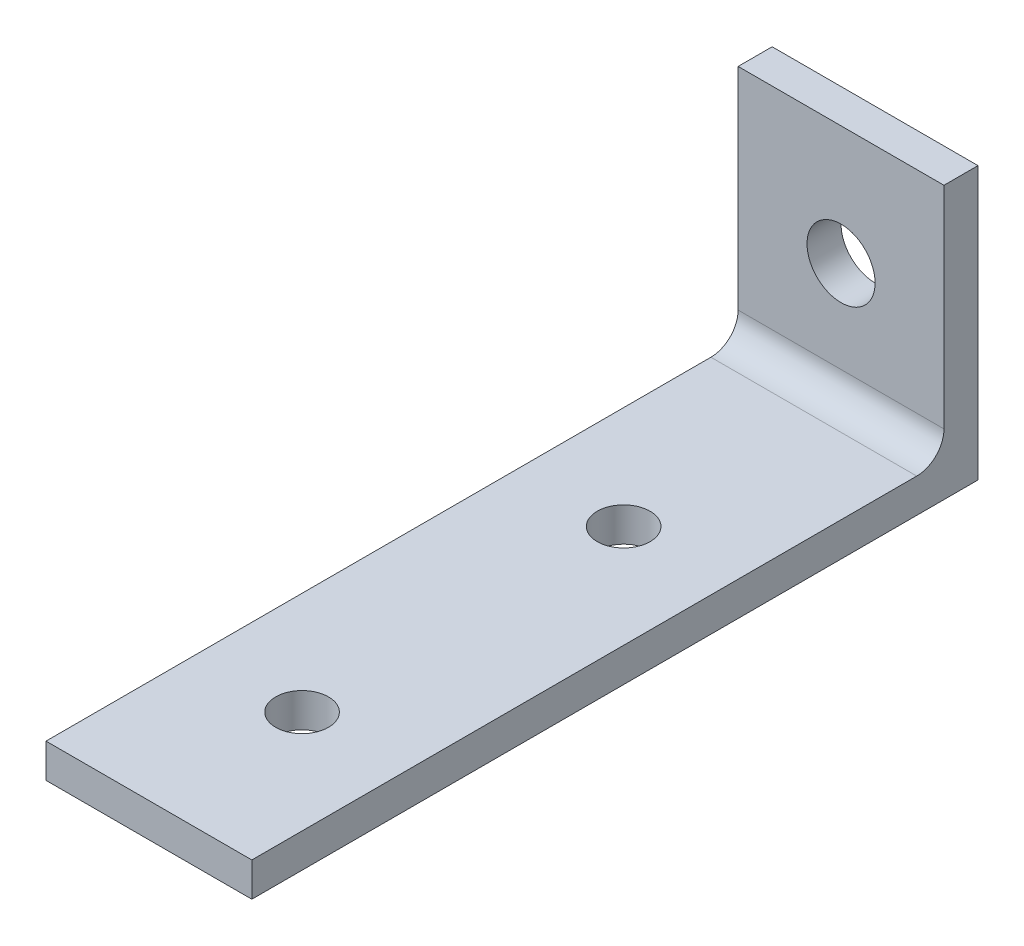
ISO-10303-21;
HEADER;
FILE_DESCRIPTION(('STEP AP214'),'2;1');
FILE_NAME('part.step','',(''),(''),'','','');
FILE_SCHEMA(('AUTOMOTIVE_DESIGN { 1 0 10303 214 1 1 1 1 }'));
ENDSEC;
DATA;
#1=APPLICATION_CONTEXT('core data for automotive mechanical design processes');
#2=APPLICATION_PROTOCOL_DEFINITION('international standard','automotive_design',2000,#1);
#3=PRODUCT_CONTEXT('',#1,'mechanical');
#4=PRODUCT('Part','Part','',(#3));
#5=PRODUCT_RELATED_PRODUCT_CATEGORY('part','',(#4));
#6=PRODUCT_DEFINITION_FORMATION('','',#4);
#7=PRODUCT_DEFINITION_CONTEXT('part definition',#1,'design');
#8=PRODUCT_DEFINITION('design','',#6,#7);
#9=PRODUCT_DEFINITION_SHAPE('','',#8);
#10=(LENGTH_UNIT() NAMED_UNIT(*) SI_UNIT(.MILLI.,.METRE.));
#11=(NAMED_UNIT(*) PLANE_ANGLE_UNIT() SI_UNIT($,.RADIAN.));
#12=(NAMED_UNIT(*) SI_UNIT($,.STERADIAN.) SOLID_ANGLE_UNIT());
#13=UNCERTAINTY_MEASURE_WITH_UNIT(LENGTH_MEASURE(1.E-05),#10,'distance_accuracy_value','');
#14=(GEOMETRIC_REPRESENTATION_CONTEXT(3) GLOBAL_UNCERTAINTY_ASSIGNED_CONTEXT((#13)) GLOBAL_UNIT_ASSIGNED_CONTEXT((#10,
#11,#12)) REPRESENTATION_CONTEXT('',''));
#15=CARTESIAN_POINT('',(0.,0.,0.));
#16=DIRECTION('',(0.,0.,1.));
#17=DIRECTION('',(1.,0.,0.));
#18=AXIS2_PLACEMENT_3D('',#15,#16,#17);
#19=CARTESIAN_POINT('',(19.2024,12.7,-22.225));
#20=DIRECTION('',(0.,0.,-1.));
#21=DIRECTION('',(0.,1.,0.));
#22=AXIS2_PLACEMENT_3D('',#19,#20,#21);
#23=PLANE('',#22);
#24=CARTESIAN_POINT('',(9.6012,1.5875,-22.225));
#25=DIRECTION('',(0.,0.,1.));
#26=DIRECTION('',(1.,0.,0.));
#27=AXIS2_PLACEMENT_3D('',#24,#25,#26);
#28=CIRCLE('',#27,3.175);
#29=CARTESIAN_POINT('',(12.7762,1.5875,-22.225));
#30=VERTEX_POINT('',#29);
#31=EDGE_CURVE('E138',#30,#30,#28,.T.);
#32=ORIENTED_EDGE('',*,*,#31,.F.);
#33=EDGE_LOOP('',(#32));
#34=FACE_BOUND('',#33,.T.);
#35=DIRECTION('',(0.,-1.,0.));
#36=VECTOR('',#35,1.);
#37=CARTESIAN_POINT('',(0.,12.7,-22.225));
#38=LINE('',#37,#36);
#39=CARTESIAN_POINT('',(0.,12.7,-22.225));
#40=VERTEX_POINT('',#39);
#41=CARTESIAN_POINT('',(0.,-6.985,-22.225));
#42=VERTEX_POINT('',#41);
#43=EDGE_CURVE('E110',#40,#42,#38,.T.);
#44=ORIENTED_EDGE('',*,*,#43,.T.);
#45=DIRECTION('',(-1.,0.,0.));
#46=VECTOR('',#45,1.);
#47=CARTESIAN_POINT('',(19.2024,-6.985,-22.225));
#48=LINE('',#47,#46);
#49=CARTESIAN_POINT('',(19.2024,-6.985,-22.225));
#50=VERTEX_POINT('',#49);
#51=EDGE_CURVE('E32',#42,#50,#48,.F.);
#52=ORIENTED_EDGE('',*,*,#51,.T.);
#53=DIRECTION('',(0.,-1.,0.));
#54=VECTOR('',#53,1.);
#55=CARTESIAN_POINT('',(19.2024,12.7,-22.225));
#56=LINE('',#55,#54);
#57=CARTESIAN_POINT('',(19.2024,12.7,-22.225));
#58=VERTEX_POINT('',#57);
#59=EDGE_CURVE('E85',#58,#50,#56,.T.);
#60=ORIENTED_EDGE('',*,*,#59,.F.);
#61=DIRECTION('',(-1.,0.,0.));
#62=VECTOR('',#61,1.);
#63=CARTESIAN_POINT('',(19.2024,12.7,-22.225));
#64=LINE('',#63,#62);
#65=EDGE_CURVE('E109',#58,#40,#64,.T.);
#66=ORIENTED_EDGE('',*,*,#65,.T.);
#67=EDGE_LOOP('',(#44,#52,#60,#66));
#68=FACE_BOUND('',#67,.T.);
#69=ADVANCED_FACE('F17',(#34,#68),#23,.F.);
#70=CARTESIAN_POINT('',(19.2024,-9.525,25.4));
#71=DIRECTION('',(0.,-1.,0.));
#72=DIRECTION('',(0.,0.,-1.));
#73=AXIS2_PLACEMENT_3D('',#70,#71,#72);
#74=PLANE('',#73);
#75=CARTESIAN_POINT('',(9.6012,-9.525,-1.9457));
#76=DIRECTION('',(0.,1.,0.));
#77=DIRECTION('',(0.,0.,1.));
#78=AXIS2_PLACEMENT_3D('',#75,#76,#77);
#79=CIRCLE('',#78,2.4638);
#80=CARTESIAN_POINT('',(9.6012,-9.525,0.5181));
#81=VERTEX_POINT('',#80);
#82=EDGE_CURVE('E135',#81,#81,#79,.T.);
#83=ORIENTED_EDGE('',*,*,#82,.F.);
#84=EDGE_LOOP('',(#83));
#85=FACE_BOUND('',#84,.T.);
#86=CARTESIAN_POINT('',(9.6012,-9.525,28.0543));
#87=DIRECTION('',(0.,1.,0.));
#88=DIRECTION('',(0.,0.,1.));
#89=AXIS2_PLACEMENT_3D('',#86,#87,#88);
#90=CIRCLE('',#89,2.4638);
#91=CARTESIAN_POINT('',(9.6012,-9.525,30.5181));
#92=VERTEX_POINT('',#91);
#93=EDGE_CURVE('E160',#92,#92,#90,.T.);
#94=ORIENTED_EDGE('',*,*,#93,.F.);
#95=EDGE_LOOP('',(#94));
#96=FACE_BOUND('',#95,.T.);
#97=DIRECTION('',(0.,0.,1.));
#98=VECTOR('',#97,1.);
#99=CARTESIAN_POINT('',(19.2024,-9.525,-22.225));
#100=LINE('',#99,#98);
#101=CARTESIAN_POINT('',(19.2024,-9.525,-19.685));
#102=VERTEX_POINT('',#101);
#103=CARTESIAN_POINT('',(19.2024,-9.525,42.3418));
#104=VERTEX_POINT('',#103);
#105=EDGE_CURVE('E75',#102,#104,#100,.T.);
#106=ORIENTED_EDGE('',*,*,#105,.F.);
#107=DIRECTION('',(-1.,0.,0.));
#108=VECTOR('',#107,1.);
#109=CARTESIAN_POINT('',(0.,-9.525,-19.685));
#110=LINE('',#109,#108);
#111=CARTESIAN_POINT('',(0.,-9.525,-19.685));
#112=VERTEX_POINT('',#111);
#113=EDGE_CURVE('E94',#102,#112,#110,.T.);
#114=ORIENTED_EDGE('',*,*,#113,.T.);
#115=DIRECTION('',(0.,0.,1.));
#116=VECTOR('',#115,1.);
#117=CARTESIAN_POINT('',(0.,-9.525,25.4));
#118=LINE('',#117,#116);
#119=CARTESIAN_POINT('',(0.,-9.525,42.3418));
#120=VERTEX_POINT('',#119);
#121=EDGE_CURVE('E90',#112,#120,#118,.T.);
#122=ORIENTED_EDGE('',*,*,#121,.T.);
#123=DIRECTION('',(-1.,0.,0.));
#124=VECTOR('',#123,1.);
#125=CARTESIAN_POINT('',(19.2024,-9.525,42.3418));
#126=LINE('',#125,#124);
#127=EDGE_CURVE('E88',#104,#120,#126,.T.);
#128=ORIENTED_EDGE('',*,*,#127,.F.);
#129=EDGE_LOOP('',(#106,#114,#122,#128));
#130=FACE_BOUND('',#129,.T.);
#131=ADVANCED_FACE('F89',(#85,#96,#130),#74,.F.);
#132=CARTESIAN_POINT('',(19.2024,-9.525,42.3418));
#133=DIRECTION('',(0.,0.,-1.));
#134=DIRECTION('',(-1.,0.,0.));
#135=AXIS2_PLACEMENT_3D('',#132,#133,#134);
#136=PLANE('',#135);
#137=DIRECTION('',(0.,-1.,0.));
#138=VECTOR('',#137,1.);
#139=CARTESIAN_POINT('',(0.,-9.525,42.3418));
#140=LINE('',#139,#138);
#141=CARTESIAN_POINT('',(0.,-12.7,42.3418));
#142=VERTEX_POINT('',#141);
#143=EDGE_CURVE('E114',#120,#142,#140,.T.);
#144=ORIENTED_EDGE('',*,*,#143,.T.);
#145=DIRECTION('',(-1.,0.,0.));
#146=VECTOR('',#145,1.);
#147=CARTESIAN_POINT('',(19.2024,-12.7,42.3418));
#148=LINE('',#147,#146);
#149=CARTESIAN_POINT('',(19.2024,-12.7,42.3418));
#150=VERTEX_POINT('',#149);
#151=EDGE_CURVE('E95',#150,#142,#148,.T.);
#152=ORIENTED_EDGE('',*,*,#151,.F.);
#153=DIRECTION('',(0.,-1.,0.));
#154=VECTOR('',#153,1.);
#155=CARTESIAN_POINT('',(19.2024,-9.525,42.3418));
#156=LINE('',#155,#154);
#157=EDGE_CURVE('E79',#104,#150,#156,.T.);
#158=ORIENTED_EDGE('',*,*,#157,.F.);
#159=ORIENTED_EDGE('',*,*,#127,.T.);
#160=EDGE_LOOP('',(#144,#152,#158,#159));
#161=FACE_BOUND('',#160,.T.);
#162=ADVANCED_FACE('F97',(#161),#136,.F.);
#163=CARTESIAN_POINT('',(19.2024,-12.7,-25.4));
#164=DIRECTION('',(0.,1.,0.));
#165=DIRECTION('',(0.,0.,1.));
#166=AXIS2_PLACEMENT_3D('',#163,#164,#165);
#167=PLANE('',#166);
#168=CARTESIAN_POINT('',(9.6012,-12.7,-1.9457));
#169=DIRECTION('',(0.,1.,0.));
#170=DIRECTION('',(0.,0.,1.));
#171=AXIS2_PLACEMENT_3D('',#168,#169,#170);
#172=CIRCLE('',#171,2.4638);
#173=CARTESIAN_POINT('',(9.6012,-12.7,0.5181));
#174=VERTEX_POINT('',#173);
#175=EDGE_CURVE('E134',#174,#174,#172,.T.);
#176=ORIENTED_EDGE('',*,*,#175,.T.);
#177=EDGE_LOOP('',(#176));
#178=FACE_BOUND('',#177,.T.);
#179=CARTESIAN_POINT('',(9.6012,-12.7,28.0543));
#180=DIRECTION('',(0.,1.,0.));
#181=DIRECTION('',(0.,0.,1.));
#182=AXIS2_PLACEMENT_3D('',#179,#180,#181);
#183=CIRCLE('',#182,2.4638);
#184=CARTESIAN_POINT('',(9.6012,-12.7,30.5181));
#185=VERTEX_POINT('',#184);
#186=EDGE_CURVE('E131',#185,#185,#183,.T.);
#187=ORIENTED_EDGE('',*,*,#186,.T.);
#188=EDGE_LOOP('',(#187));
#189=FACE_BOUND('',#188,.T.);
#190=DIRECTION('',(0.,0.,-1.));
#191=VECTOR('',#190,1.);
#192=CARTESIAN_POINT('',(0.,-12.7,-25.4));
#193=LINE('',#192,#191);
#194=CARTESIAN_POINT('',(0.,-12.7,-25.4));
#195=VERTEX_POINT('',#194);
#196=EDGE_CURVE('E116',#142,#195,#193,.T.);
#197=ORIENTED_EDGE('',*,*,#196,.T.);
#198=DIRECTION('',(-1.,0.,0.));
#199=VECTOR('',#198,1.);
#200=CARTESIAN_POINT('',(19.2024,-12.7,-25.4));
#201=LINE('',#200,#199);
#202=CARTESIAN_POINT('',(19.2024,-12.7,-25.4));
#203=VERTEX_POINT('',#202);
#204=EDGE_CURVE('E127',#203,#195,#201,.T.);
#205=ORIENTED_EDGE('',*,*,#204,.F.);
#206=DIRECTION('',(0.,0.,-1.));
#207=VECTOR('',#206,1.);
#208=CARTESIAN_POINT('',(19.2024,-12.7,25.4));
#209=LINE('',#208,#207);
#210=EDGE_CURVE('E100',#150,#203,#209,.T.);
#211=ORIENTED_EDGE('',*,*,#210,.F.);
#212=ORIENTED_EDGE('',*,*,#151,.T.);
#213=EDGE_LOOP('',(#197,#205,#211,#212));
#214=FACE_BOUND('',#213,.T.);
#215=ADVANCED_FACE('F144',(#178,#189,#214),#167,.F.);
#216=CARTESIAN_POINT('',(19.2024,12.7,-25.4));
#217=DIRECTION('',(0.,0.,1.));
#218=DIRECTION('',(1.,0.,0.));
#219=AXIS2_PLACEMENT_3D('',#216,#217,#218);
#220=PLANE('',#219);
#221=CARTESIAN_POINT('',(9.6012,1.5875,-25.4));
#222=DIRECTION('',(0.,0.,1.));
#223=DIRECTION('',(1.,0.,0.));
#224=AXIS2_PLACEMENT_3D('',#221,#222,#223);
#225=CIRCLE('',#224,3.175);
#226=CARTESIAN_POINT('',(12.7762,1.5875,-25.4));
#227=VERTEX_POINT('',#226);
#228=EDGE_CURVE('E112',#227,#227,#225,.T.);
#229=ORIENTED_EDGE('',*,*,#228,.T.);
#230=EDGE_LOOP('',(#229));
#231=FACE_BOUND('',#230,.T.);
#232=DIRECTION('',(0.,1.,0.));
#233=VECTOR('',#232,1.);
#234=CARTESIAN_POINT('',(0.,12.7,-25.4));
#235=LINE('',#234,#233);
#236=CARTESIAN_POINT('',(0.,12.7,-25.4));
#237=VERTEX_POINT('',#236);
#238=EDGE_CURVE('E118',#195,#237,#235,.T.);
#239=ORIENTED_EDGE('',*,*,#238,.T.);
#240=DIRECTION('',(-1.,0.,0.));
#241=VECTOR('',#240,1.);
#242=CARTESIAN_POINT('',(19.2024,12.7,-25.4));
#243=LINE('',#242,#241);
#244=CARTESIAN_POINT('',(19.2024,12.7,-25.4));
#245=VERTEX_POINT('',#244);
#246=EDGE_CURVE('E124',#245,#237,#243,.T.);
#247=ORIENTED_EDGE('',*,*,#246,.F.);
#248=DIRECTION('',(0.,1.,0.));
#249=VECTOR('',#248,1.);
#250=CARTESIAN_POINT('',(19.2024,12.7,-25.4));
#251=LINE('',#250,#249);
#252=EDGE_CURVE('E102',#203,#245,#251,.T.);
#253=ORIENTED_EDGE('',*,*,#252,.F.);
#254=ORIENTED_EDGE('',*,*,#204,.T.);
#255=EDGE_LOOP('',(#239,#247,#253,#254));
#256=FACE_BOUND('',#255,.T.);
#257=ADVANCED_FACE('F151',(#231,#256),#220,.F.);
#258=CARTESIAN_POINT('',(19.2024,12.7,-22.225));
#259=DIRECTION('',(0.,-1.,0.));
#260=DIRECTION('',(0.,0.,-1.));
#261=AXIS2_PLACEMENT_3D('',#258,#259,#260);
#262=PLANE('',#261);
#263=DIRECTION('',(0.,0.,1.));
#264=VECTOR('',#263,1.);
#265=CARTESIAN_POINT('',(0.,12.7,-22.225));
#266=LINE('',#265,#264);
#267=EDGE_CURVE('E120',#237,#40,#266,.T.);
#268=ORIENTED_EDGE('',*,*,#267,.T.);
#269=ORIENTED_EDGE('',*,*,#65,.F.);
#270=DIRECTION('',(0.,0.,1.));
#271=VECTOR('',#270,1.);
#272=CARTESIAN_POINT('',(19.2024,12.7,-22.225));
#273=LINE('',#272,#271);
#274=EDGE_CURVE('E107',#245,#58,#273,.T.);
#275=ORIENTED_EDGE('',*,*,#274,.F.);
#276=ORIENTED_EDGE('',*,*,#246,.T.);
#277=EDGE_LOOP('',(#268,#269,#275,#276));
#278=FACE_BOUND('',#277,.T.);
#279=ADVANCED_FACE('F154',(#278),#262,.F.);
#280=CARTESIAN_POINT('',(19.2024,0.,0.));
#281=DIRECTION('',(-1.,0.,0.));
#282=DIRECTION('',(0.,0.,1.));
#283=AXIS2_PLACEMENT_3D('',#280,#281,#282);
#284=PLANE('',#283);
#285=ORIENTED_EDGE('',*,*,#59,.T.);
#286=CARTESIAN_POINT('',(19.2024,-6.985,-19.685));
#287=DIRECTION('',(-1.,0.,0.));
#288=DIRECTION('',(0.,0.,1.));
#289=AXIS2_PLACEMENT_3D('',#286,#287,#288);
#290=CIRCLE('',#289,2.54);
#291=EDGE_CURVE('E11',#50,#102,#290,.T.);
#292=ORIENTED_EDGE('',*,*,#291,.T.);
#293=ORIENTED_EDGE('',*,*,#105,.T.);
#294=ORIENTED_EDGE('',*,*,#157,.T.);
#295=ORIENTED_EDGE('',*,*,#210,.T.);
#296=ORIENTED_EDGE('',*,*,#252,.T.);
#297=ORIENTED_EDGE('',*,*,#274,.T.);
#298=EDGE_LOOP('',(#285,#292,#293,#294,#295,#296,#297));
#299=FACE_BOUND('',#298,.T.);
#300=ADVANCED_FACE('F77',(#299),#284,.F.);
#301=CARTESIAN_POINT('',(0.,0.,0.));
#302=DIRECTION('',(-1.,0.,0.));
#303=DIRECTION('',(0.,0.,1.));
#304=AXIS2_PLACEMENT_3D('',#301,#302,#303);
#305=PLANE('',#304);
#306=ORIENTED_EDGE('',*,*,#43,.F.);
#307=ORIENTED_EDGE('',*,*,#267,.F.);
#308=ORIENTED_EDGE('',*,*,#238,.F.);
#309=ORIENTED_EDGE('',*,*,#196,.F.);
#310=ORIENTED_EDGE('',*,*,#143,.F.);
#311=ORIENTED_EDGE('',*,*,#121,.F.);
#312=CARTESIAN_POINT('',(0.,-6.985,-19.685));
#313=DIRECTION('',(-1.,0.,0.));
#314=DIRECTION('',(0.,0.,1.));
#315=AXIS2_PLACEMENT_3D('',#312,#313,#314);
#316=CIRCLE('',#315,2.54);
#317=EDGE_CURVE('E25',#112,#42,#316,.F.);
#318=ORIENTED_EDGE('',*,*,#317,.T.);
#319=EDGE_LOOP('',(#306,#307,#308,#309,#310,#311,#318));
#320=FACE_BOUND('',#319,.T.);
#321=ADVANCED_FACE('F141',(#320),#305,.T.);
#322=CARTESIAN_POINT('',(9.6012,1.5875,-25.4));
#323=DIRECTION('',(0.,0.,1.));
#324=DIRECTION('',(1.,0.,0.));
#325=AXIS2_PLACEMENT_3D('',#322,#323,#324);
#326=CYLINDRICAL_SURFACE('',#325,3.175);
#327=ORIENTED_EDGE('',*,*,#228,.F.);
#328=EDGE_LOOP('',(#327));
#329=FACE_BOUND('',#328,.T.);
#330=ORIENTED_EDGE('',*,*,#31,.T.);
#331=EDGE_LOOP('',(#330));
#332=FACE_BOUND('',#331,.T.);
#333=ADVANCED_FACE('F177',(#329,#332),#326,.F.);
#334=CARTESIAN_POINT('',(9.6012,-47.625,28.0543));
#335=DIRECTION('',(0.,1.,0.));
#336=DIRECTION('',(0.,0.,1.));
#337=AXIS2_PLACEMENT_3D('',#334,#335,#336);
#338=CYLINDRICAL_SURFACE('',#337,2.4638);
#339=ORIENTED_EDGE('',*,*,#93,.T.);
#340=EDGE_LOOP('',(#339));
#341=FACE_BOUND('',#340,.T.);
#342=ORIENTED_EDGE('',*,*,#186,.F.);
#343=EDGE_LOOP('',(#342));
#344=FACE_BOUND('',#343,.T.);
#345=ADVANCED_FACE('F174',(#341,#344),#338,.F.);
#346=CARTESIAN_POINT('',(9.6012,-47.625,-1.94570000000003));
#347=DIRECTION('',(0.,1.,0.));
#348=DIRECTION('',(0.,0.,1.));
#349=AXIS2_PLACEMENT_3D('',#346,#347,#348);
#350=CYLINDRICAL_SURFACE('',#349,2.4638);
#351=ORIENTED_EDGE('',*,*,#82,.T.);
#352=EDGE_LOOP('',(#351));
#353=FACE_BOUND('',#352,.T.);
#354=ORIENTED_EDGE('',*,*,#175,.F.);
#355=EDGE_LOOP('',(#354));
#356=FACE_BOUND('',#355,.T.);
#357=ADVANCED_FACE('F166',(#353,#356),#350,.F.);
#358=CARTESIAN_POINT('',(19.2024,-6.985,-19.685));
#359=DIRECTION('',(1.,0.,0.));
#360=DIRECTION('',(0.,0.,-1.));
#361=AXIS2_PLACEMENT_3D('',#358,#359,#360);
#362=CYLINDRICAL_SURFACE('',#361,2.54);
#363=ORIENTED_EDGE('',*,*,#291,.F.);
#364=ORIENTED_EDGE('',*,*,#51,.F.);
#365=ORIENTED_EDGE('',*,*,#317,.F.);
#366=ORIENTED_EDGE('',*,*,#113,.F.);
#367=EDGE_LOOP('',(#363,#364,#365,#366));
#368=FACE_BOUND('',#367,.T.);
#369=ADVANCED_FACE('F19',(#368),#362,.F.);
#370=CLOSED_SHELL('',(#69,#131,#162,#215,#257,#279,#300,#321,#333,#345,#357,#369));
#371=MANIFOLD_SOLID_BREP('B1',#370);
#372=ADVANCED_BREP_SHAPE_REPRESENTATION('',(#18,#371),#14);
#373=SHAPE_DEFINITION_REPRESENTATION(#9,#372);
ENDSEC;
END-ISO-10303-21;
